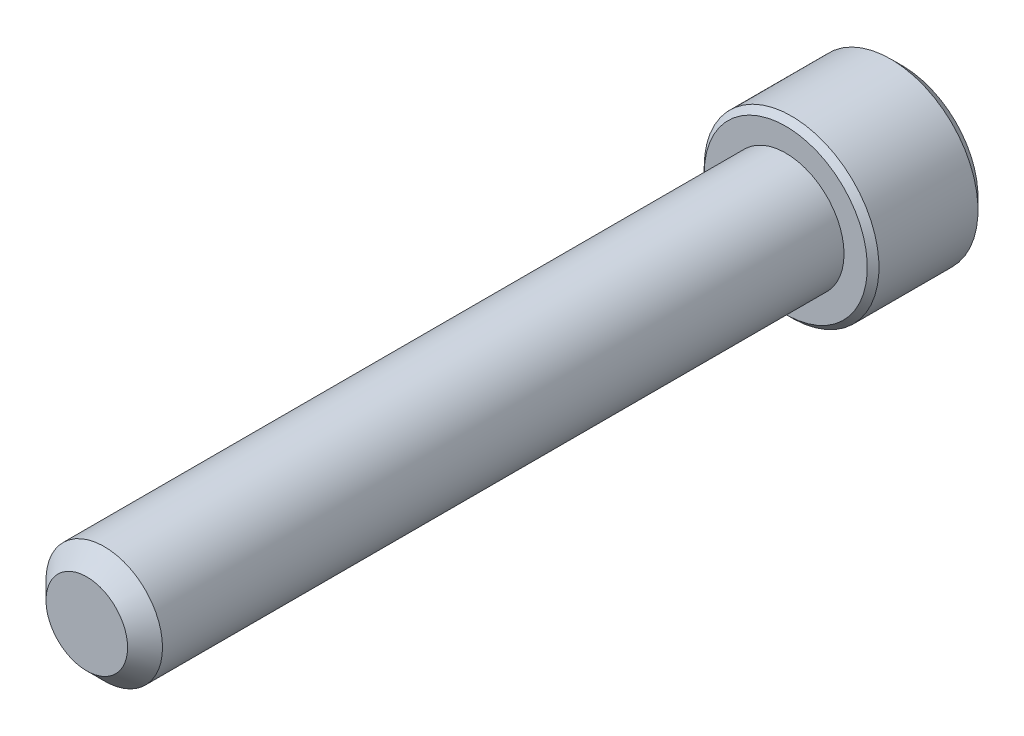
ISO-10303-21;
HEADER;
FILE_DESCRIPTION(('STEP AP214'),'2;1');
FILE_NAME('part.step','',(''),(''),'','','');
FILE_SCHEMA(('AUTOMOTIVE_DESIGN { 1 0 10303 214 1 1 1 1 }'));
ENDSEC;
DATA;
#1=APPLICATION_CONTEXT('core data for automotive mechanical design processes');
#2=APPLICATION_PROTOCOL_DEFINITION('international standard','automotive_design',2000,#1);
#3=PRODUCT_CONTEXT('',#1,'mechanical');
#4=PRODUCT('Part','Part','',(#3));
#5=PRODUCT_RELATED_PRODUCT_CATEGORY('part','',(#4));
#6=PRODUCT_DEFINITION_FORMATION('','',#4);
#7=PRODUCT_DEFINITION_CONTEXT('part definition',#1,'design');
#8=PRODUCT_DEFINITION('design','',#6,#7);
#9=PRODUCT_DEFINITION_SHAPE('','',#8);
#10=(LENGTH_UNIT() NAMED_UNIT(*) SI_UNIT(.MILLI.,.METRE.));
#11=(NAMED_UNIT(*) PLANE_ANGLE_UNIT() SI_UNIT($,.RADIAN.));
#12=(NAMED_UNIT(*) SI_UNIT($,.STERADIAN.) SOLID_ANGLE_UNIT());
#13=UNCERTAINTY_MEASURE_WITH_UNIT(LENGTH_MEASURE(1.E-05),#10,'distance_accuracy_value','');
#14=(GEOMETRIC_REPRESENTATION_CONTEXT(3) GLOBAL_UNCERTAINTY_ASSIGNED_CONTEXT((#13)) GLOBAL_UNIT_ASSIGNED_CONTEXT((#10,
#11,#12)) REPRESENTATION_CONTEXT('',''));
#15=CARTESIAN_POINT('',(0.,0.,0.));
#16=DIRECTION('',(0.,0.,1.));
#17=DIRECTION('',(1.,0.,0.));
#18=AXIS2_PLACEMENT_3D('',#15,#16,#17);
#19=CARTESIAN_POINT('',(0.,0.,-38.1));
#20=DIRECTION('',(0.,0.,1.));
#21=DIRECTION('',(1.,0.,0.));
#22=AXIS2_PLACEMENT_3D('',#19,#20,#21);
#23=CYLINDRICAL_SURFACE('',#22,3.175);
#24=CARTESIAN_POINT('',(0.,0.,-0.952499999999988));
#25=DIRECTION('',(0.,0.,1.));
#26=DIRECTION('',(1.,0.,0.));
#27=AXIS2_PLACEMENT_3D('',#24,#25,#26);
#28=CIRCLE('',#27,3.175);
#29=CARTESIAN_POINT('',(3.175,0.,-0.952499999999995));
#30=VERTEX_POINT('',#29);
#31=EDGE_CURVE('E11',#30,#30,#28,.F.);
#32=CARTESIAN_POINT('',(0.,0.,-38.1));
#33=DIRECTION('',(0.,0.,-1.));
#34=DIRECTION('',(-1.,0.,0.));
#35=AXIS2_PLACEMENT_3D('',#32,#33,#34);
#36=CIRCLE('',#35,3.175);
#37=CARTESIAN_POINT('',(3.175,0.,-38.1));
#38=VERTEX_POINT('',#37);
#39=EDGE_CURVE('E107',#38,#38,#36,.F.);
#40=CARTESIAN_POINT('',(3.175,0.,-0.952499999999995));
#41=CARTESIAN_POINT('',(3.175,0.,-1.339453125));
#42=CARTESIAN_POINT('',(3.175,0.,-1.72640625));
#43=CARTESIAN_POINT('',(3.175,0.,-2.5003125));
#44=CARTESIAN_POINT('',(3.175,0.,-2.887265625));
#45=CARTESIAN_POINT('',(3.175,0.,-3.661171875));
#46=CARTESIAN_POINT('',(3.175,0.,-4.048125));
#47=CARTESIAN_POINT('',(3.175,0.,-4.82203125));
#48=CARTESIAN_POINT('',(3.175,0.,-5.208984375));
#49=CARTESIAN_POINT('',(3.175,0.,-5.982890625));
#50=CARTESIAN_POINT('',(3.175,0.,-6.36984375));
#51=CARTESIAN_POINT('',(3.175,0.,-7.14375));
#52=CARTESIAN_POINT('',(3.175,0.,-7.53070312499999));
#53=CARTESIAN_POINT('',(3.175,0.,-8.30460937499999));
#54=CARTESIAN_POINT('',(3.175,0.,-8.69156249999999));
#55=CARTESIAN_POINT('',(3.175,0.,-9.46546874999999));
#56=CARTESIAN_POINT('',(3.175,0.,-9.85242187499999));
#57=CARTESIAN_POINT('',(3.175,0.,-10.626328125));
#58=CARTESIAN_POINT('',(3.175,0.,-11.01328125));
#59=CARTESIAN_POINT('',(3.175,0.,-11.7871875));
#60=CARTESIAN_POINT('',(3.175,0.,-12.174140625));
#61=CARTESIAN_POINT('',(3.175,0.,-12.948046875));
#62=CARTESIAN_POINT('',(3.175,0.,-13.335));
#63=CARTESIAN_POINT('',(3.175,0.,-14.10890625));
#64=CARTESIAN_POINT('',(3.175,0.,-14.495859375));
#65=CARTESIAN_POINT('',(3.175,0.,-15.269765625));
#66=CARTESIAN_POINT('',(3.175,0.,-15.65671875));
#67=CARTESIAN_POINT('',(3.175,0.,-16.430625));
#68=CARTESIAN_POINT('',(3.175,0.,-16.817578125));
#69=CARTESIAN_POINT('',(3.175,0.,-17.591484375));
#70=CARTESIAN_POINT('',(3.175,0.,-17.9784375));
#71=CARTESIAN_POINT('',(3.175,0.,-18.75234375));
#72=CARTESIAN_POINT('',(3.175,0.,-19.139296875));
#73=CARTESIAN_POINT('',(3.175,0.,-19.913203125));
#74=CARTESIAN_POINT('',(3.175,0.,-20.30015625));
#75=CARTESIAN_POINT('',(3.175,0.,-21.0740625));
#76=CARTESIAN_POINT('',(3.175,0.,-21.461015625));
#77=CARTESIAN_POINT('',(3.175,0.,-22.234921875));
#78=CARTESIAN_POINT('',(3.175,0.,-22.621875));
#79=CARTESIAN_POINT('',(3.175,0.,-23.39578125));
#80=CARTESIAN_POINT('',(3.175,0.,-23.782734375));
#81=CARTESIAN_POINT('',(3.175,0.,-24.556640625));
#82=CARTESIAN_POINT('',(3.175,0.,-24.94359375));
#83=CARTESIAN_POINT('',(3.175,0.,-25.7175));
#84=CARTESIAN_POINT('',(3.175,0.,-26.104453125));
#85=CARTESIAN_POINT('',(3.175,0.,-26.878359375));
#86=CARTESIAN_POINT('',(3.175,0.,-27.2653125));
#87=CARTESIAN_POINT('',(3.175,0.,-28.03921875));
#88=CARTESIAN_POINT('',(3.175,0.,-28.426171875));
#89=CARTESIAN_POINT('',(3.175,0.,-29.200078125));
#90=CARTESIAN_POINT('',(3.175,0.,-29.58703125));
#91=CARTESIAN_POINT('',(3.175,0.,-30.3609375));
#92=CARTESIAN_POINT('',(3.175,0.,-30.747890625));
#93=CARTESIAN_POINT('',(3.175,0.,-31.521796875));
#94=CARTESIAN_POINT('',(3.175,0.,-31.90875));
#95=CARTESIAN_POINT('',(3.175,0.,-32.68265625));
#96=CARTESIAN_POINT('',(3.175,0.,-33.069609375));
#97=CARTESIAN_POINT('',(3.175,0.,-33.843515625));
#98=CARTESIAN_POINT('',(3.175,0.,-34.23046875));
#99=CARTESIAN_POINT('',(3.175,0.,-35.004375));
#100=CARTESIAN_POINT('',(3.175,0.,-35.391328125));
#101=CARTESIAN_POINT('',(3.175,0.,-36.165234375));
#102=CARTESIAN_POINT('',(3.175,0.,-36.5521875));
#103=CARTESIAN_POINT('',(3.175,0.,-37.32609375));
#104=CARTESIAN_POINT('',(3.175,0.,-37.713046875));
#105=CARTESIAN_POINT('',(3.175,0.,-38.1));
#106=B_SPLINE_CURVE_WITH_KNOTS('',3,(#40,#41,#42,#43,#44,#45,#46,#47,#48,#49,#50,#51,#52,#53,
#54,#55,#56,#57,#58,#59,#60,#61,#62,#63,#64,#65,#66,#67,#68,#69,#70,#71,#72,#73,#74,#75,#76,#77,
#78,#79,#80,#81,#82,#83,#84,#85,#86,#87,#88,#89,#90,#91,#92,#93,#94,#95,#96,#97,#98,#99,#100,
#101,#102,#103,#104,#105),.UNSPECIFIED.,.F.,.F.,(4,2,2,2,2,2,2,2,2,2,2,2,2,2,2,2,2,2,2,2,2,2,2,
2,2,2,2,2,2,2,2,2,4),(0.,1.160859375,2.32171875,3.482578125,4.6434375,5.804296875,6.96515625,
8.126015625,9.286875,10.447734375,11.60859375,12.769453125,13.9303125,15.091171875,16.25203125,
17.412890625,18.57375,19.734609375,20.89546875,22.056328125,23.2171875,24.378046875,25.53890625,
26.699765625,27.860625,29.021484375,30.18234375,31.343203125,32.5040625,33.664921875,
34.82578125,35.986640625,37.1475),.UNSPECIFIED.);
#107=EDGE_CURVE('BSEAM33',#30,#38,#106,.T.);
#108=ORIENTED_EDGE('',*,*,#31,.T.);
#109=ORIENTED_EDGE('',*,*,#39,.T.);
#110=ORIENTED_EDGE('',*,*,#107,.T.);
#111=ORIENTED_EDGE('',*,*,#107,.F.);
#112=EDGE_LOOP('',(#108,#110,#109,#111));
#113=FACE_BOUND('',#112,.T.);
#114=ADVANCED_FACE('F33',(#113),#23,.T.);
#115=CARTESIAN_POINT('',(0.,0.,0.));
#116=DIRECTION('',(0.,0.,1.));
#117=DIRECTION('',(1.,0.,0.));
#118=AXIS2_PLACEMENT_3D('',#115,#116,#117);
#119=PLANE('',#118);
#120=CARTESIAN_POINT('',(0.,0.,0.));
#121=DIRECTION('',(0.,0.,1.));
#122=DIRECTION('',(1.,0.,0.));
#123=AXIS2_PLACEMENT_3D('',#120,#121,#122);
#124=CIRCLE('',#123,2.22250000000002);
#125=CARTESIAN_POINT('',(2.22250000000002,0.,0.));
#126=VERTEX_POINT('',#125);
#127=EDGE_CURVE('E41',#126,#126,#124,.T.);
#128=ORIENTED_EDGE('',*,*,#127,.T.);
#129=EDGE_LOOP('',(#128));
#130=FACE_BOUND('',#129,.T.);
#131=ADVANCED_FACE('F177',(#130),#119,.T.);
#132=CARTESIAN_POINT('',(0.,0.,-44.45));
#133=DIRECTION('',(0.,0.,1.));
#134=DIRECTION('',(1.,0.,0.));
#135=AXIS2_PLACEMENT_3D('',#132,#133,#134);
#136=CYLINDRICAL_SURFACE('',#135,4.7625);
#137=CARTESIAN_POINT('',(0.,0.,-38.4175));
#138=DIRECTION('',(0.,0.,-1.));
#139=DIRECTION('',(-1.,0.,0.));
#140=AXIS2_PLACEMENT_3D('',#137,#138,#139);
#141=CIRCLE('',#140,4.7625);
#142=CARTESIAN_POINT('',(-4.7625,0.,-38.4175));
#143=VERTEX_POINT('',#142);
#144=EDGE_CURVE('E169',#143,#143,#141,.T.);
#145=ORIENTED_EDGE('',*,*,#144,.T.);
#146=EDGE_LOOP('',(#145));
#147=FACE_BOUND('',#146,.T.);
#148=CARTESIAN_POINT('',(0.,0.,-43.815));
#149=DIRECTION('',(0.,0.,-1.));
#150=DIRECTION('',(-1.,0.,0.));
#151=AXIS2_PLACEMENT_3D('',#148,#149,#150);
#152=CIRCLE('',#151,4.7625);
#153=CARTESIAN_POINT('',(-4.7625,0.,-43.815));
#154=VERTEX_POINT('',#153);
#155=EDGE_CURVE('E166',#154,#154,#152,.F.);
#156=ORIENTED_EDGE('',*,*,#155,.T.);
#157=EDGE_LOOP('',(#156));
#158=FACE_BOUND('',#157,.T.);
#159=ADVANCED_FACE('F194',(#147,#158),#136,.T.);
#160=CARTESIAN_POINT('',(0.,0.,-44.45));
#161=DIRECTION('',(0.,0.,-1.));
#162=DIRECTION('',(-1.,0.,0.));
#163=AXIS2_PLACEMENT_3D('',#160,#161,#162);
#164=PLANE('',#163);
#165=CARTESIAN_POINT('',(0.,0.,-44.45));
#166=DIRECTION('',(0.,0.,-1.));
#167=DIRECTION('',(-1.,0.,0.));
#168=AXIS2_PLACEMENT_3D('',#165,#166,#167);
#169=CIRCLE('',#168,4.12750000000001);
#170=CARTESIAN_POINT('',(-4.12750000000001,0.,-44.45));
#171=VERTEX_POINT('',#170);
#172=EDGE_CURVE('E106',#171,#171,#169,.T.);
#173=ORIENTED_EDGE('',*,*,#172,.T.);
#174=EDGE_LOOP('',(#173));
#175=FACE_BOUND('',#174,.T.);
#176=CARTESIAN_POINT('',(0.,0.,-44.45));
#177=DIRECTION('',(0.,0.,-1.));
#178=DIRECTION('',(-1.,0.,0.));
#179=AXIS2_PLACEMENT_3D('',#176,#177,#178);
#180=CIRCLE('',#179,2.74963065701559);
#181=CARTESIAN_POINT('',(-2.38125,1.3748153285078,-44.45));
#182=VERTEX_POINT('',#181);
#183=CARTESIAN_POINT('',(0.,2.74963065701559,-44.45));
#184=VERTEX_POINT('',#183);
#185=EDGE_CURVE('E87',#182,#184,#180,.T.);
#186=ORIENTED_EDGE('',*,*,#185,.F.);
#187=CARTESIAN_POINT('',(-2.38125,-1.3748153285078,-44.45));
#188=VERTEX_POINT('',#187);
#189=EDGE_CURVE('E47',#188,#182,#180,.T.);
#190=ORIENTED_EDGE('',*,*,#189,.F.);
#191=CARTESIAN_POINT('',(0.,-2.74963065701559,-44.45));
#192=VERTEX_POINT('',#191);
#193=EDGE_CURVE('E401',#192,#188,#180,.T.);
#194=ORIENTED_EDGE('',*,*,#193,.F.);
#195=CARTESIAN_POINT('',(2.38125,-1.3748153285078,-44.45));
#196=VERTEX_POINT('',#195);
#197=EDGE_CURVE('E54',#196,#192,#180,.T.);
#198=ORIENTED_EDGE('',*,*,#197,.F.);
#199=CARTESIAN_POINT('',(2.38125,1.3748153285078,-44.45));
#200=VERTEX_POINT('',#199);
#201=EDGE_CURVE('E128',#200,#196,#180,.T.);
#202=ORIENTED_EDGE('',*,*,#201,.F.);
#203=EDGE_CURVE('E96',#184,#200,#180,.T.);
#204=ORIENTED_EDGE('',*,*,#203,.F.);
#205=EDGE_LOOP('',(#186,#190,#194,#198,#202,#204));
#206=FACE_BOUND('',#205,.T.);
#207=ADVANCED_FACE('F127',(#175,#206),#164,.T.);
#208=CARTESIAN_POINT('',(0.,0.,-38.1));
#209=DIRECTION('',(0.,0.,-1.));
#210=DIRECTION('',(-1.,0.,0.));
#211=AXIS2_PLACEMENT_3D('',#208,#209,#210);
#212=PLANE('',#211);
#213=CARTESIAN_POINT('',(0.,0.,-38.1));
#214=DIRECTION('',(0.,0.,-1.));
#215=DIRECTION('',(-1.,0.,0.));
#216=AXIS2_PLACEMENT_3D('',#213,#214,#215);
#217=CIRCLE('',#216,4.445);
#218=CARTESIAN_POINT('',(-4.445,0.,-38.1));
#219=VERTEX_POINT('',#218);
#220=EDGE_CURVE('E172',#219,#219,#217,.F.);
#221=ORIENTED_EDGE('',*,*,#220,.T.);
#222=EDGE_LOOP('',(#221));
#223=FACE_BOUND('',#222,.T.);
#224=ORIENTED_EDGE('',*,*,#39,.F.);
#225=EDGE_LOOP('',(#224));
#226=FACE_BOUND('',#225,.T.);
#227=ADVANCED_FACE('F210',(#223,#226),#212,.F.);
#228=CARTESIAN_POINT('',(0.,0.,-44.45));
#229=DIRECTION('',(0.,0.,-1.));
#230=DIRECTION('',(-1.,0.,0.));
#231=AXIS2_PLACEMENT_3D('',#228,#229,#230);
#232=CONICAL_SURFACE('',#231,2.74963065701559,0.78539816339745);
#233=ORIENTED_EDGE('',*,*,#203,.T.);
#234=CARTESIAN_POINT('',(-0.000199999999998693,2.74974612706943,-44.4501154773272));
#235=CARTESIAN_POINT('',(0.0816567823790511,2.70248609172789,-44.4028948967095));
#236=CARTESIAN_POINT('',(0.164882333771761,2.65443579722785,-44.3584475752929));
#237=CARTESIAN_POINT('',(0.334588480838042,2.556455907536,-44.2770654569856));
#238=CARTESIAN_POINT('',(0.421085217353105,2.50651699342501,-44.2401759430951));
#239=CARTESIAN_POINT('',(0.595501774009046,2.40581754748857,-44.1769834131659));
#240=CARTESIAN_POINT('',(0.683377171180679,2.35508266327638,-44.1505215587295));
#241=CARTESIAN_POINT('',(0.86106259407088,2.25249593653965,-44.1097515156161));
#242=CARTESIAN_POINT('',(0.950867191185876,2.20064722822084,-44.0954128915306));
#243=CARTESIAN_POINT('',(1.10563960313035,2.11128933452158,-44.0824757847701));
#244=CARTESIAN_POINT('',(1.17040744896962,2.07389560129144,-44.0805606046532));
#245=CARTESIAN_POINT('',(1.29983727933558,1.99916925388849,-44.0837866227677));
#246=CARTESIAN_POINT('',(1.36449921879336,1.96183666573621,-44.0889302948571));
#247=CARTESIAN_POINT('',(1.4932125485774,1.8875239901371,-44.1059813108716));
#248=CARTESIAN_POINT('',(1.55726317423486,1.85054434417201,-44.1178962213493));
#249=CARTESIAN_POINT('',(1.68425683890528,1.77722451768916,-44.147835672352));
#250=CARTESIAN_POINT('',(1.74719996243583,1.74088428837516,-44.1658597445185));
#251=CARTESIAN_POINT('',(1.90842615073219,1.64780030516185,-44.2193688075524));
#252=CARTESIAN_POINT('',(2.00570949128784,1.59163374230437,-44.2588874208722));
#253=CARTESIAN_POINT('',(2.14875606262557,1.50904576583588,-44.3256003435508));
#254=CARTESIAN_POINT('',(2.19589628894397,1.48182934348129,-44.3490402091113));
#255=CARTESIAN_POINT('',(2.28930352636664,1.42790064981106,-44.3980566766595));
#256=CARTESIAN_POINT('',(2.33557105249682,1.40118808114506,-44.4236319667669));
#257=CARTESIAN_POINT('',(2.38145,1.37469985845396,-44.4501154773272));
#258=B_SPLINE_CURVE_WITH_KNOTS('',3,(#234,#235,#236,#237,#238,#239,#240,#241,#242,#243,#244,
#245,#246,#247,#248,#249,#250,#251,#252,#253,#254,#255,#256,#257),.UNSPECIFIED.,.F.,.F.,(4,2,2,
2,2,2,2,2,2,2,2,4),(0.,0.317196610611949,0.63624146104122,0.950218950629225,1.26340583824126,
1.48752413747844,1.71172100167747,1.93616888974082,2.16059957440836,2.51709639744763,
2.69486147369099,2.87251813383154),.UNSPECIFIED.);
#259=EDGE_CURVE('E101',#184,#200,#258,.T.);
#260=ORIENTED_EDGE('',*,*,#259,.F.);
#261=EDGE_LOOP('',(#233,#260));
#262=FACE_BOUND('',#261,.T.);
#263=ADVANCED_FACE('F102',(#262),#232,.F.);
#264=ORIENTED_EDGE('',*,*,#201,.T.);
#265=CARTESIAN_POINT('',(2.38125,-2.76261914417824,-45.3476170859106));
#266=CARTESIAN_POINT('',(2.38125,-2.69544479514943,-45.2967472144995));
#267=CARTESIAN_POINT('',(2.38125,-2.62789666136504,-45.246362945401));
#268=CARTESIAN_POINT('',(2.38125,-2.49190448957586,-45.1467837706916));
#269=CARTESIAN_POINT('',(2.38125,-2.42346023302515,-45.0975891638687));
#270=CARTESIAN_POINT('',(2.38125,-2.28502676055597,-45.0002575506406));
#271=CARTESIAN_POINT('',(2.38125,-2.21502968474887,-44.9521316855727));
#272=CARTESIAN_POINT('',(2.38125,-2.07385103533268,-44.8576556100283));
#273=CARTESIAN_POINT('',(2.38125,-2.00266954553302,-44.811305274675));
#274=CARTESIAN_POINT('',(2.38125,-1.85474026830089,-44.7181368560841));
#275=CARTESIAN_POINT('',(2.38125,-1.77790995624221,-44.6714491375715));
#276=CARTESIAN_POINT('',(2.38125,-1.62247617005921,-44.5811296057942));
#277=CARTESIAN_POINT('',(2.38125,-1.5438729311814,-44.5374973902174));
#278=CARTESIAN_POINT('',(2.38125,-1.38486272128665,-44.4542071099829));
#279=CARTESIAN_POINT('',(2.38125,-1.30446163385103,-44.4145379008969));
#280=CARTESIAN_POINT('',(2.38125,-1.14145314541121,-44.3400690458985));
#281=CARTESIAN_POINT('',(2.38125,-1.05884677103565,-44.3052671795911));
#282=CARTESIAN_POINT('',(2.38125,-0.89829608328261,-44.2444298132105));
#283=CARTESIAN_POINT('',(2.38125,-0.820539229676336,-44.2179047139138));
#284=CARTESIAN_POINT('',(2.38125,-0.663135380788208,-44.17108983919));
#285=CARTESIAN_POINT('',(2.38125,-0.583488257424663,-44.1508004875941));
#286=CARTESIAN_POINT('',(2.38125,-0.424114177011518,-44.1178604073761));
#287=CARTESIAN_POINT('',(2.38125,-0.344414987413468,-44.1050775336893));
#288=CARTESIAN_POINT('',(2.38125,-0.184141832260062,-44.0874018129175));
#289=CARTESIAN_POINT('',(2.38125,-0.103568024425045,-44.0825075663093));
#290=CARTESIAN_POINT('',(2.38125,0.0546452705616223,-44.0809814589787));
#291=CARTESIAN_POINT('',(2.38125,0.132281935936971,-44.0840477838015));
#292=CARTESIAN_POINT('',(2.38125,0.286899761946938,-44.0976029014762));
#293=CARTESIAN_POINT('',(2.38125,0.363880858805093,-44.1080924083237));
#294=CARTESIAN_POINT('',(2.38125,0.517934845692858,-44.1360957917082));
#295=CARTESIAN_POINT('',(2.38125,0.594985552658724,-44.1537299282713));
#296=CARTESIAN_POINT('',(2.38125,0.747397785123017,-44.1950790150478));
#297=CARTESIAN_POINT('',(2.38125,0.822759444233745,-44.2187934824167));
#298=CARTESIAN_POINT('',(2.38125,1.05910849758949,-44.3021079749779));
#299=CARTESIAN_POINT('',(2.38125,1.21677702119331,-44.3711581303657));
#300=CARTESIAN_POINT('',(2.38125,1.44750538939387,-44.4862600463764));
#301=CARTESIAN_POINT('',(2.38125,1.52359597421916,-44.5266390557991));
#302=CARTESIAN_POINT('',(2.38125,1.67404919609776,-44.6105045048813));
#303=CARTESIAN_POINT('',(2.38125,1.74841214000065,-44.6539903870446));
#304=CARTESIAN_POINT('',(2.38125,1.89195740338857,-44.7412197494794));
#305=CARTESIAN_POINT('',(2.38125,1.96121356031989,-44.7848431033927));
#306=CARTESIAN_POINT('',(2.38125,2.09853826202222,-44.8739297074865));
#307=CARTESIAN_POINT('',(2.38125,2.16660671643359,-44.9193930967897));
#308=CARTESIAN_POINT('',(2.38125,2.30115854952532,-45.0114552847002));
#309=CARTESIAN_POINT('',(2.38125,2.36765030430945,-45.0580418921343));
#310=CARTESIAN_POINT('',(2.38125,2.49972444234839,-45.1524503252218));
#311=CARTESIAN_POINT('',(2.38125,2.56530707078417,-45.2002718074761));
#312=CARTESIAN_POINT('',(2.38125,2.63050907003793,-45.2485984125418));
#313=B_SPLINE_CURVE_WITH_KNOTS('',3,(#265,#266,#267,#268,#269,#270,#271,#272,#273,#274,#275,
#276,#277,#278,#279,#280,#281,#282,#283,#284,#285,#286,#287,#288,#289,#290,#291,#292,#293,#294,
#295,#296,#297,#298,#299,#300,#301,#302,#303,#304,#305,#306,#307,#308,#309,#310,#311,#312),
.UNSPECIFIED.,.F.,.F.,(4,2,2,2,2,2,2,2,2,2,2,2,2,2,2,2,2,2,2,2,2,2,2,4),(0.,0.252791871571635,
0.505646586835585,0.760459562131612,1.01525458283614,1.28490904188232,1.55452792903167,
1.82336591130764,2.09208085165786,2.33833488206072,2.58460564615637,2.82639989360531,
3.06815123955511,3.30087188920716,3.53361492603846,3.7704500560164,4.00726638452656,
4.52203846870487,4.78044014413053,5.03879556793988,5.28431582240013,5.52985467514944,
5.77340315432296,6.0168846207659),.UNSPECIFIED.);
#314=EDGE_CURVE('E95',#200,#196,#313,.F.);
#315=ORIENTED_EDGE('',*,*,#314,.F.);
#316=EDGE_LOOP('',(#264,#315));
#317=FACE_BOUND('',#316,.T.);
#318=ADVANCED_FACE('F276',(#317),#232,.F.);
#319=ORIENTED_EDGE('',*,*,#197,.T.);
#320=CARTESIAN_POINT('',(2.38145,-1.37469985845396,-44.4501154773272));
#321=CARTESIAN_POINT('',(2.29959321762095,-1.4219598937955,-44.4028948967095));
#322=CARTESIAN_POINT('',(2.21636766622824,-1.47001018829553,-44.3584475752929));
#323=CARTESIAN_POINT('',(2.04666151916196,-1.56799007798738,-44.2770654569856));
#324=CARTESIAN_POINT('',(1.9601647826469,-1.61792899209838,-44.2401759430951));
#325=CARTESIAN_POINT('',(1.78574822599096,-1.71862843803481,-44.1769834131659));
#326=CARTESIAN_POINT('',(1.69787282881933,-1.769363322247,-44.1505215587295));
#327=CARTESIAN_POINT('',(1.52018740592913,-1.87195004898373,-44.1097515156161));
#328=CARTESIAN_POINT('',(1.43038280881413,-1.92379875730254,-44.0954128915305));
#329=CARTESIAN_POINT('',(1.27561039686967,-2.01315665100181,-44.0824757847701));
#330=CARTESIAN_POINT('',(1.21084255103039,-2.05055038423194,-44.0805606046532));
#331=CARTESIAN_POINT('',(1.08141272066443,-2.1252767316349,-44.0837866227677));
#332=CARTESIAN_POINT('',(1.01675078120665,-2.16260931978717,-44.0889302948571));
#333=CARTESIAN_POINT('',(0.88803745142261,-2.23692199538628,-44.1059813108716));
#334=CARTESIAN_POINT('',(0.823986825765153,-2.27390164135138,-44.1178962213493));
#335=CARTESIAN_POINT('',(0.696993161094733,-2.34722146783422,-44.147835672352));
#336=CARTESIAN_POINT('',(0.634050037564182,-2.38356169714822,-44.1658597445184));
#337=CARTESIAN_POINT('',(0.472823849267825,-2.47664568036154,-44.2193688075524));
#338=CARTESIAN_POINT('',(0.375540508712167,-2.53281224321901,-44.2588874208722));
#339=CARTESIAN_POINT('',(0.232493937374436,-2.6154002196875,-44.3256003435508));
#340=CARTESIAN_POINT('',(0.185353711056041,-2.64261664204209,-44.3490402091113));
#341=CARTESIAN_POINT('',(0.0919464736333639,-2.69654533571233,-44.3980566766595));
#342=CARTESIAN_POINT('',(0.0456789475031785,-2.72325790437833,-44.4236319667669));
#343=CARTESIAN_POINT('',(-0.000200000000001961,-2.74974612706943,-44.4501154773272));
#344=B_SPLINE_CURVE_WITH_KNOTS('',3,(#320,#321,#322,#323,#324,#325,#326,#327,#328,#329,#330,
#331,#332,#333,#334,#335,#336,#337,#338,#339,#340,#341,#342,#343),.UNSPECIFIED.,.F.,.F.,(4,2,2,
2,2,2,2,2,2,2,2,4),(0.,0.317196610611946,0.636241461041214,0.950218950629217,1.26340583824125,
1.48752413747843,1.71172100167746,1.93616888974081,2.16059957440835,2.51709639744762,
2.69486147369098,2.87251813383154),.UNSPECIFIED.);
#345=EDGE_CURVE('E137',#196,#192,#344,.T.);
#346=ORIENTED_EDGE('',*,*,#345,.F.);
#347=EDGE_LOOP('',(#319,#346));
#348=FACE_BOUND('',#347,.T.);
#349=ADVANCED_FACE('F268',(#348),#232,.F.);
#350=ORIENTED_EDGE('',*,*,#193,.T.);
#351=CARTESIAN_POINT('',(0.000200000000001271,-2.74974612706943,-44.4501154773272));
#352=CARTESIAN_POINT('',(-0.0816567823790474,-2.70248609172789,-44.4028948967095));
#353=CARTESIAN_POINT('',(-0.164882333771757,-2.65443579722785,-44.3584475752929));
#354=CARTESIAN_POINT('',(-0.334588480838036,-2.556455907536,-44.2770654569856));
#355=CARTESIAN_POINT('',(-0.421085217353099,-2.50651699342501,-44.2401759430951));
#356=CARTESIAN_POINT('',(-0.595501774009038,-2.40581754748857,-44.1769834131659));
#357=CARTESIAN_POINT('',(-0.68337717118067,-2.35508266327639,-44.1505215587295));
#358=CARTESIAN_POINT('',(-0.86106259407087,-2.25249593653966,-44.1097515156161));
#359=CARTESIAN_POINT('',(-0.950867191185865,-2.20064722822085,-44.0954128915305));
#360=CARTESIAN_POINT('',(-1.10563960313033,-2.11128933452158,-44.0824757847701));
#361=CARTESIAN_POINT('',(-1.17040744896961,-2.07389560129144,-44.0805606046532));
#362=CARTESIAN_POINT('',(-1.29983727933557,-1.99916925388849,-44.0837866227677));
#363=CARTESIAN_POINT('',(-1.36449921879335,-1.96183666573622,-44.0889302948571));
#364=CARTESIAN_POINT('',(-1.49321254857739,-1.88752399013711,-44.1059813108716));
#365=CARTESIAN_POINT('',(-1.55726317423485,-1.85054434417201,-44.1178962213493));
#366=CARTESIAN_POINT('',(-1.68425683890527,-1.77722451768917,-44.147835672352));
#367=CARTESIAN_POINT('',(-1.74719996243582,-1.74088428837517,-44.1658597445184));
#368=CARTESIAN_POINT('',(-1.90842615073217,-1.64780030516185,-44.2193688075524));
#369=CARTESIAN_POINT('',(-2.00570949128783,-1.59163374230437,-44.2588874208722));
#370=CARTESIAN_POINT('',(-2.14875606262556,-1.50904576583588,-44.3256003435508));
#371=CARTESIAN_POINT('',(-2.19589628894396,-1.4818293434813,-44.3490402091113));
#372=CARTESIAN_POINT('',(-2.28930352636663,-1.42790064981106,-44.3980566766595));
#373=CARTESIAN_POINT('',(-2.33557105249682,-1.40118808114506,-44.4236319667669));
#374=CARTESIAN_POINT('',(-2.38145,-1.37469985845396,-44.4501154773272));
#375=B_SPLINE_CURVE_WITH_KNOTS('',3,(#351,#352,#353,#354,#355,#356,#357,#358,#359,#360,#361,
#362,#363,#364,#365,#366,#367,#368,#369,#370,#371,#372,#373,#374),.UNSPECIFIED.,.F.,.F.,(4,2,2,
2,2,2,2,2,2,2,2,4),(0.,0.317196610611946,0.636241461041214,0.950218950629217,1.26340583824125,
1.48752413747843,1.71172100167746,1.93616888974081,2.16059957440835,2.51709639744762,
2.69486147369098,2.87251813383154),.UNSPECIFIED.);
#376=EDGE_CURVE('E364',#192,#188,#375,.T.);
#377=ORIENTED_EDGE('',*,*,#376,.F.);
#378=EDGE_LOOP('',(#350,#377));
#379=FACE_BOUND('',#378,.T.);
#380=ADVANCED_FACE('F261',(#379),#232,.F.);
#381=ORIENTED_EDGE('',*,*,#189,.T.);
#382=CARTESIAN_POINT('',(-2.38125,-2.76261914417824,-45.3476170859106));
#383=CARTESIAN_POINT('',(-2.38125,-2.69544479514944,-45.2967472144995));
#384=CARTESIAN_POINT('',(-2.38125,-2.62789666136504,-45.246362945401));
#385=CARTESIAN_POINT('',(-2.38125,-2.49190448957587,-45.1467837706916));
#386=CARTESIAN_POINT('',(-2.38125,-2.42346023302515,-45.0975891638687));
#387=CARTESIAN_POINT('',(-2.38125,-2.28502676055597,-45.0002575506406));
#388=CARTESIAN_POINT('',(-2.38125,-2.21502968474887,-44.9521316855727));
#389=CARTESIAN_POINT('',(-2.38125,-2.07385103533268,-44.8576556100283));
#390=CARTESIAN_POINT('',(-2.38125,-2.00266954553303,-44.811305274675));
#391=CARTESIAN_POINT('',(-2.38125,-1.85474026830089,-44.7181368560841));
#392=CARTESIAN_POINT('',(-2.38125,-1.77790995624221,-44.6714491375715));
#393=CARTESIAN_POINT('',(-2.38125,-1.62247617005921,-44.5811296057942));
#394=CARTESIAN_POINT('',(-2.38125,-1.5438729311814,-44.5374973902174));
#395=CARTESIAN_POINT('',(-2.38125,-1.38486272128664,-44.4542071099829));
#396=CARTESIAN_POINT('',(-2.38125,-1.30446163385103,-44.4145379008969));
#397=CARTESIAN_POINT('',(-2.38125,-1.14145314541121,-44.3400690458985));
#398=CARTESIAN_POINT('',(-2.38125,-1.05884677103565,-44.3052671795911));
#399=CARTESIAN_POINT('',(-2.38125,-0.898296083282613,-44.2444298132105));
#400=CARTESIAN_POINT('',(-2.38125,-0.820539229676338,-44.2179047139138));
#401=CARTESIAN_POINT('',(-2.38125,-0.663135380788209,-44.17108983919));
#402=CARTESIAN_POINT('',(-2.38125,-0.583488257424665,-44.1508004875941));
#403=CARTESIAN_POINT('',(-2.38125,-0.424114177011519,-44.1178604073761));
#404=CARTESIAN_POINT('',(-2.38125,-0.344414987413469,-44.1050775336893));
#405=CARTESIAN_POINT('',(-2.38125,-0.184141832260063,-44.0874018129175));
#406=CARTESIAN_POINT('',(-2.38125,-0.103568024425046,-44.0825075663093));
#407=CARTESIAN_POINT('',(-2.38125,0.0546452705616218,-44.0809814589787));
#408=CARTESIAN_POINT('',(-2.38125,0.132281935936971,-44.0840477838014));
#409=CARTESIAN_POINT('',(-2.38125,0.286899761946938,-44.0976029014762));
#410=CARTESIAN_POINT('',(-2.38125,0.363880858805093,-44.1080924083237));
#411=CARTESIAN_POINT('',(-2.38125,0.517934845692858,-44.1360957917082));
#412=CARTESIAN_POINT('',(-2.38125,0.594985552658725,-44.1537299282713));
#413=CARTESIAN_POINT('',(-2.38125,0.747397785123018,-44.1950790150478));
#414=CARTESIAN_POINT('',(-2.38125,0.822759444233746,-44.2187934824167));
#415=CARTESIAN_POINT('',(-2.38125,1.05910849758949,-44.3021079749779));
#416=CARTESIAN_POINT('',(-2.38125,1.21677702119331,-44.3711581303657));
#417=CARTESIAN_POINT('',(-2.38125,1.44750538939387,-44.4862600463764));
#418=CARTESIAN_POINT('',(-2.38125,1.52359597421916,-44.5266390557991));
#419=CARTESIAN_POINT('',(-2.38125,1.67404919609775,-44.6105045048813));
#420=CARTESIAN_POINT('',(-2.38125,1.74841214000065,-44.6539903870446));
#421=CARTESIAN_POINT('',(-2.38125,1.89195740338856,-44.7412197494794));
#422=CARTESIAN_POINT('',(-2.38125,1.96121356031988,-44.7848431033927));
#423=CARTESIAN_POINT('',(-2.38125,2.09853826202221,-44.8739297074865));
#424=CARTESIAN_POINT('',(-2.38125,2.16660671643358,-44.9193930967897));
#425=CARTESIAN_POINT('',(-2.38125,2.30115854952532,-45.0114552847002));
#426=CARTESIAN_POINT('',(-2.38125,2.36765030430945,-45.0580418921343));
#427=CARTESIAN_POINT('',(-2.38125,2.49972444234839,-45.1524503252218));
#428=CARTESIAN_POINT('',(-2.38125,2.56530707078417,-45.2002718074761));
#429=CARTESIAN_POINT('',(-2.38125,2.63050907003794,-45.2485984125418));
#430=B_SPLINE_CURVE_WITH_KNOTS('',3,(#382,#383,#384,#385,#386,#387,#388,#389,#390,#391,#392,
#393,#394,#395,#396,#397,#398,#399,#400,#401,#402,#403,#404,#405,#406,#407,#408,#409,#410,#411,
#412,#413,#414,#415,#416,#417,#418,#419,#420,#421,#422,#423,#424,#425,#426,#427,#428,#429),
.UNSPECIFIED.,.F.,.F.,(4,2,2,2,2,2,2,2,2,2,2,2,2,2,2,2,2,2,2,2,2,2,2,4),(0.,0.252791871571636,
0.505646586835587,0.760459562131614,1.01525458283614,1.28490904188232,1.55452792903167,
1.82336591130764,2.09208085165786,2.33833488206072,2.58460564615638,2.82639989360531,
3.06815123955512,3.30087188920716,3.53361492603847,3.7704500560164,4.00726638452657,
4.52203846870487,4.78044014413053,5.03879556793987,5.28431582240013,5.52985467514944,
5.77340315432296,6.0168846207659),.UNSPECIFIED.);
#431=EDGE_CURVE('E117',#188,#182,#430,.T.);
#432=ORIENTED_EDGE('',*,*,#431,.F.);
#433=EDGE_LOOP('',(#381,#432));
#434=FACE_BOUND('',#433,.T.);
#435=ADVANCED_FACE('F253',(#434),#232,.F.);
#436=ORIENTED_EDGE('',*,*,#185,.T.);
#437=CARTESIAN_POINT('',(-2.38145,1.37469985845396,-44.4501154773272));
#438=CARTESIAN_POINT('',(-2.29959321762095,1.4219598937955,-44.4028948967095));
#439=CARTESIAN_POINT('',(-2.21636766622824,1.47001018829554,-44.3584475752929));
#440=CARTESIAN_POINT('',(-2.04666151916196,1.56799007798739,-44.2770654569856));
#441=CARTESIAN_POINT('',(-1.96016478264689,1.61792899209839,-44.2401759430951));
#442=CARTESIAN_POINT('',(-1.78574822599095,1.71862843803482,-44.1769834131659));
#443=CARTESIAN_POINT('',(-1.69787282881932,1.76936332224701,-44.1505215587295));
#444=CARTESIAN_POINT('',(-1.52018740592912,1.87195004898374,-44.1097515156161));
#445=CARTESIAN_POINT('',(-1.43038280881412,1.92379875730255,-44.0954128915306));
#446=CARTESIAN_POINT('',(-1.27561039686965,2.01315665100181,-44.0824757847701));
#447=CARTESIAN_POINT('',(-1.21084255103038,2.05055038423195,-44.0805606046532));
#448=CARTESIAN_POINT('',(-1.08141272066442,2.1252767316349,-44.0837866227677));
#449=CARTESIAN_POINT('',(-1.01675078120664,2.16260931978718,-44.0889302948571));
#450=CARTESIAN_POINT('',(-0.888037451422597,2.23692199538629,-44.1059813108716));
#451=CARTESIAN_POINT('',(-0.82398682576514,2.27390164135138,-44.1178962213493));
#452=CARTESIAN_POINT('',(-0.696993161094721,2.34722146783423,-44.147835672352));
#453=CARTESIAN_POINT('',(-0.63405003756417,2.38356169714823,-44.1658597445185));
#454=CARTESIAN_POINT('',(-0.472823849267813,2.47664568036155,-44.2193688075524));
#455=CARTESIAN_POINT('',(-0.375540508712155,2.53281224321902,-44.2588874208722));
#456=CARTESIAN_POINT('',(-0.232493937374424,2.61540021968751,-44.3256003435508));
#457=CARTESIAN_POINT('',(-0.185353711056029,2.6426166420421,-44.3490402091113));
#458=CARTESIAN_POINT('',(-0.0919464736333571,2.69654533571234,-44.3980566766595));
#459=CARTESIAN_POINT('',(-0.0456789475031759,2.72325790437834,-44.4236319667669));
#460=CARTESIAN_POINT('',(0.000200000000000753,2.74974612706943,-44.4501154773272));
#461=B_SPLINE_CURVE_WITH_KNOTS('',3,(#437,#438,#439,#440,#441,#442,#443,#444,#445,#446,#447,
#448,#449,#450,#451,#452,#453,#454,#455,#456,#457,#458,#459,#460),.UNSPECIFIED.,.F.,.F.,(4,2,2,
2,2,2,2,2,2,2,2,4),(0.,0.317196610611948,0.636241461041219,0.950218950629225,1.26340583824126,
1.48752413747844,1.71172100167747,1.93616888974082,2.16059957440836,2.51709639744763,
2.69486147369099,2.87251813383154),.UNSPECIFIED.);
#462=EDGE_CURVE('E91',#182,#184,#461,.T.);
#463=ORIENTED_EDGE('',*,*,#462,.F.);
#464=EDGE_LOOP('',(#436,#463));
#465=FACE_BOUND('',#464,.T.);
#466=ADVANCED_FACE('F89',(#465),#232,.F.);
#467=CARTESIAN_POINT('',(-2.38125,1.3748153285078,-40.878125));
#468=DIRECTION('',(0.,0.,1.));
#469=DIRECTION('',(1.,0.,0.));
#470=AXIS2_PLACEMENT_3D('',#467,#468,#469);
#471=PLANE('',#470);
#472=DIRECTION('',(0.866025403784439,0.5,0.));
#473=VECTOR('',#472,1.);
#474=CARTESIAN_POINT('',(-2.38125,1.3748153285078,-40.878125));
#475=LINE('',#474,#473);
#476=CARTESIAN_POINT('',(-2.38125,1.3748153285078,-40.878125));
#477=VERTEX_POINT('',#476);
#478=CARTESIAN_POINT('',(0.,2.74963065701559,-40.878125));
#479=VERTEX_POINT('',#478);
#480=EDGE_CURVE('E116',#477,#479,#475,.T.);
#481=ORIENTED_EDGE('',*,*,#480,.T.);
#482=DIRECTION('',(0.866025403784439,-0.5,0.));
#483=VECTOR('',#482,1.);
#484=CARTESIAN_POINT('',(0.,2.74963065701559,-40.878125));
#485=LINE('',#484,#483);
#486=CARTESIAN_POINT('',(2.38125,1.3748153285078,-40.878125));
#487=VERTEX_POINT('',#486);
#488=EDGE_CURVE('E121',#479,#487,#485,.T.);
#489=ORIENTED_EDGE('',*,*,#488,.T.);
#490=DIRECTION('',(0.,-1.,0.));
#491=VECTOR('',#490,1.);
#492=CARTESIAN_POINT('',(2.38125,1.3748153285078,-40.878125));
#493=LINE('',#492,#491);
#494=CARTESIAN_POINT('',(2.38125,-1.3748153285078,-40.878125));
#495=VERTEX_POINT('',#494);
#496=EDGE_CURVE('E374',#487,#495,#493,.T.);
#497=ORIENTED_EDGE('',*,*,#496,.T.);
#498=DIRECTION('',(-0.866025403784439,-0.5,0.));
#499=VECTOR('',#498,1.);
#500=CARTESIAN_POINT('',(2.38125,-1.3748153285078,-40.878125));
#501=LINE('',#500,#499);
#502=CARTESIAN_POINT('',(0.,-2.74963065701559,-40.878125));
#503=VERTEX_POINT('',#502);
#504=EDGE_CURVE('E377',#495,#503,#501,.T.);
#505=ORIENTED_EDGE('',*,*,#504,.T.);
#506=DIRECTION('',(-0.866025403784439,0.5,0.));
#507=VECTOR('',#506,1.);
#508=CARTESIAN_POINT('',(0.,-2.74963065701559,-40.878125));
#509=LINE('',#508,#507);
#510=CARTESIAN_POINT('',(-2.38125,-1.3748153285078,-40.878125));
#511=VERTEX_POINT('',#510);
#512=EDGE_CURVE('E380',#503,#511,#509,.T.);
#513=ORIENTED_EDGE('',*,*,#512,.T.);
#514=DIRECTION('',(0.,1.,0.));
#515=VECTOR('',#514,1.);
#516=CARTESIAN_POINT('',(-2.38125,-1.3748153285078,-40.878125));
#517=LINE('',#516,#515);
#518=EDGE_CURVE('E124',#511,#477,#517,.T.);
#519=ORIENTED_EDGE('',*,*,#518,.T.);
#520=EDGE_LOOP('',(#481,#489,#497,#505,#513,#519));
#521=FACE_BOUND('',#520,.T.);
#522=ADVANCED_FACE('F156',(#521),#471,.F.);
#523=CARTESIAN_POINT('',(0.,2.74963065701559,-40.878125));
#524=DIRECTION('',(0.5,0.866025403784439,0.));
#525=DIRECTION('',(-0.866025403784439,0.5,0.));
#526=AXIS2_PLACEMENT_3D('',#523,#524,#525);
#527=PLANE('',#526);
#528=DIRECTION('',(0.,0.,-1.));
#529=VECTOR('',#528,1.);
#530=CARTESIAN_POINT('',(0.,2.74963065701559,-40.878125));
#531=LINE('',#530,#529);
#532=EDGE_CURVE('E113',#479,#184,#531,.T.);
#533=ORIENTED_EDGE('',*,*,#532,.T.);
#534=ORIENTED_EDGE('',*,*,#259,.T.);
#535=DIRECTION('',(0.,0.,-1.));
#536=VECTOR('',#535,1.);
#537=CARTESIAN_POINT('',(2.38125,1.3748153285078,-40.878125));
#538=LINE('',#537,#536);
#539=EDGE_CURVE('E123',#487,#200,#538,.T.);
#540=ORIENTED_EDGE('',*,*,#539,.F.);
#541=ORIENTED_EDGE('',*,*,#488,.F.);
#542=EDGE_LOOP('',(#533,#534,#540,#541));
#543=FACE_BOUND('',#542,.T.);
#544=ADVANCED_FACE('F119',(#543),#527,.F.);
#545=CARTESIAN_POINT('',(2.38125,1.3748153285078,-40.878125));
#546=DIRECTION('',(1.,0.,0.));
#547=DIRECTION('',(0.,1.,0.));
#548=AXIS2_PLACEMENT_3D('',#545,#546,#547);
#549=PLANE('',#548);
#550=ORIENTED_EDGE('',*,*,#539,.T.);
#551=ORIENTED_EDGE('',*,*,#314,.T.);
#552=DIRECTION('',(0.,0.,-1.));
#553=VECTOR('',#552,1.);
#554=CARTESIAN_POINT('',(2.38125,-1.3748153285078,-40.878125));
#555=LINE('',#554,#553);
#556=EDGE_CURVE('E391',#495,#196,#555,.T.);
#557=ORIENTED_EDGE('',*,*,#556,.F.);
#558=ORIENTED_EDGE('',*,*,#496,.F.);
#559=EDGE_LOOP('',(#550,#551,#557,#558));
#560=FACE_BOUND('',#559,.T.);
#561=ADVANCED_FACE('F145',(#560),#549,.F.);
#562=CARTESIAN_POINT('',(2.38125,-1.3748153285078,-40.878125));
#563=DIRECTION('',(0.5,-0.866025403784439,0.));
#564=DIRECTION('',(0.866025403784439,0.5,0.));
#565=AXIS2_PLACEMENT_3D('',#562,#563,#564);
#566=PLANE('',#565);
#567=ORIENTED_EDGE('',*,*,#556,.T.);
#568=ORIENTED_EDGE('',*,*,#345,.T.);
#569=DIRECTION('',(0.,0.,-1.));
#570=VECTOR('',#569,1.);
#571=CARTESIAN_POINT('',(0.,-2.74963065701559,-40.878125));
#572=LINE('',#571,#570);
#573=EDGE_CURVE('E388',#503,#192,#572,.T.);
#574=ORIENTED_EDGE('',*,*,#573,.F.);
#575=ORIENTED_EDGE('',*,*,#504,.F.);
#576=EDGE_LOOP('',(#567,#568,#574,#575));
#577=FACE_BOUND('',#576,.T.);
#578=ADVANCED_FACE('F149',(#577),#566,.F.);
#579=CARTESIAN_POINT('',(0.,-2.74963065701559,-40.878125));
#580=DIRECTION('',(-0.5,-0.866025403784439,0.));
#581=DIRECTION('',(0.866025403784439,-0.5,0.));
#582=AXIS2_PLACEMENT_3D('',#579,#580,#581);
#583=PLANE('',#582);
#584=ORIENTED_EDGE('',*,*,#573,.T.);
#585=ORIENTED_EDGE('',*,*,#376,.T.);
#586=DIRECTION('',(0.,0.,-1.));
#587=VECTOR('',#586,1.);
#588=CARTESIAN_POINT('',(-2.38125,-1.3748153285078,-40.878125));
#589=LINE('',#588,#587);
#590=EDGE_CURVE('E386',#511,#188,#589,.T.);
#591=ORIENTED_EDGE('',*,*,#590,.F.);
#592=ORIENTED_EDGE('',*,*,#512,.F.);
#593=EDGE_LOOP('',(#584,#585,#591,#592));
#594=FACE_BOUND('',#593,.T.);
#595=ADVANCED_FACE('F312',(#594),#583,.F.);
#596=CARTESIAN_POINT('',(-2.38125,-1.3748153285078,-40.878125));
#597=DIRECTION('',(-1.,0.,0.));
#598=DIRECTION('',(0.,-1.,0.));
#599=AXIS2_PLACEMENT_3D('',#596,#597,#598);
#600=PLANE('',#599);
#601=ORIENTED_EDGE('',*,*,#590,.T.);
#602=ORIENTED_EDGE('',*,*,#431,.T.);
#603=DIRECTION('',(0.,0.,-1.));
#604=VECTOR('',#603,1.);
#605=CARTESIAN_POINT('',(-2.38125,1.3748153285078,-40.878125));
#606=LINE('',#605,#604);
#607=EDGE_CURVE('E115',#477,#182,#606,.T.);
#608=ORIENTED_EDGE('',*,*,#607,.F.);
#609=ORIENTED_EDGE('',*,*,#518,.F.);
#610=EDGE_LOOP('',(#601,#602,#608,#609));
#611=FACE_BOUND('',#610,.T.);
#612=ADVANCED_FACE('F204',(#611),#600,.F.);
#613=CARTESIAN_POINT('',(-2.38125,1.3748153285078,-40.878125));
#614=DIRECTION('',(-0.5,0.866025403784439,0.));
#615=DIRECTION('',(-0.866025403784439,-0.5,0.));
#616=AXIS2_PLACEMENT_3D('',#613,#614,#615);
#617=PLANE('',#616);
#618=ORIENTED_EDGE('',*,*,#607,.T.);
#619=ORIENTED_EDGE('',*,*,#462,.T.);
#620=ORIENTED_EDGE('',*,*,#532,.F.);
#621=ORIENTED_EDGE('',*,*,#480,.F.);
#622=EDGE_LOOP('',(#618,#619,#620,#621));
#623=FACE_BOUND('',#622,.T.);
#624=ADVANCED_FACE('F111',(#623),#617,.F.);
#625=CARTESIAN_POINT('',(0.,0.,-44.45));
#626=DIRECTION('',(0.,0.,1.));
#627=DIRECTION('',(1.,0.,0.));
#628=AXIS2_PLACEMENT_3D('',#625,#626,#627);
#629=CONICAL_SURFACE('',#628,4.12750000000001,0.785398163397441);
#630=ORIENTED_EDGE('',*,*,#155,.F.);
#631=EDGE_LOOP('',(#630));
#632=FACE_BOUND('',#631,.T.);
#633=ORIENTED_EDGE('',*,*,#172,.F.);
#634=EDGE_LOOP('',(#633));
#635=FACE_BOUND('',#634,.T.);
#636=ADVANCED_FACE('F185',(#632,#635),#629,.T.);
#637=CARTESIAN_POINT('',(0.,0.,-38.4175));
#638=DIRECTION('',(0.,0.,-1.));
#639=DIRECTION('',(-1.,0.,0.));
#640=AXIS2_PLACEMENT_3D('',#637,#638,#639);
#641=CONICAL_SURFACE('',#640,4.7625,0.785398163397444);
#642=ORIENTED_EDGE('',*,*,#220,.F.);
#643=EDGE_LOOP('',(#642));
#644=FACE_BOUND('',#643,.T.);
#645=ORIENTED_EDGE('',*,*,#144,.F.);
#646=EDGE_LOOP('',(#645));
#647=FACE_BOUND('',#646,.T.);
#648=ADVANCED_FACE('F180',(#644,#647),#641,.T.);
#649=CARTESIAN_POINT('',(0.,0.,0.));
#650=DIRECTION('',(0.,0.,-1.));
#651=DIRECTION('',(-1.,0.,0.));
#652=AXIS2_PLACEMENT_3D('',#649,#650,#651);
#653=CONICAL_SURFACE('',#652,2.22250000000002,0.78539816339745);
#654=ORIENTED_EDGE('',*,*,#31,.F.);
#655=EDGE_LOOP('',(#654));
#656=FACE_BOUND('',#655,.T.);
#657=ORIENTED_EDGE('',*,*,#127,.F.);
#658=EDGE_LOOP('',(#657));
#659=FACE_BOUND('',#658,.T.);
#660=ADVANCED_FACE('F35',(#656,#659),#653,.T.);
#661=CLOSED_SHELL('',(#114,#131,#159,#207,#227,#263,#318,#349,#380,#435,#466,#522,#544,#561,
#578,#595,#612,#624,#636,#648,#660));
#662=MANIFOLD_SOLID_BREP('B2',#661);
#663=ADVANCED_BREP_SHAPE_REPRESENTATION('',(#18,#662),#14);
#664=SHAPE_DEFINITION_REPRESENTATION(#9,#663);
ENDSEC;
END-ISO-10303-21;
